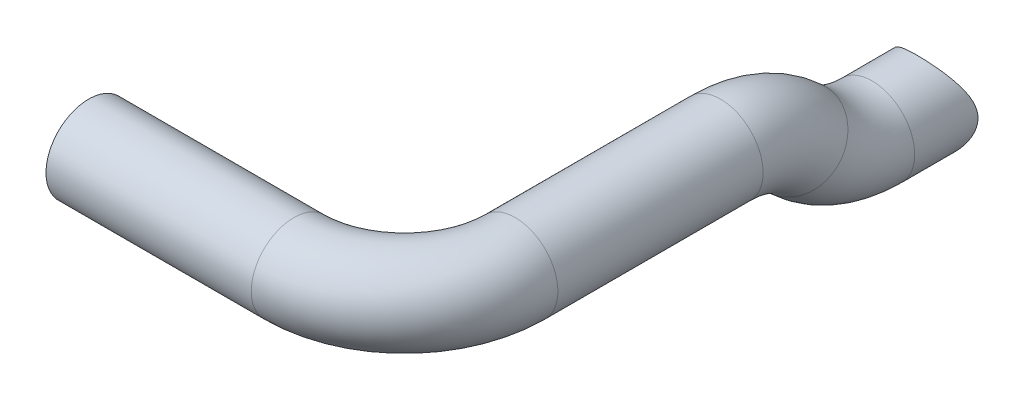
ISO-10303-21;
HEADER;
FILE_DESCRIPTION(('STEP AP214'),'2;1');
FILE_NAME('part.step','',(''),(''),'','','');
FILE_SCHEMA(('AUTOMOTIVE_DESIGN { 1 0 10303 214 1 1 1 1 }'));
ENDSEC;
DATA;
#1=APPLICATION_CONTEXT('core data for automotive mechanical design processes');
#2=APPLICATION_PROTOCOL_DEFINITION('international standard','automotive_design',2000,#1);
#3=PRODUCT_CONTEXT('',#1,'mechanical');
#4=PRODUCT('Part','Part','',(#3));
#5=PRODUCT_RELATED_PRODUCT_CATEGORY('part','',(#4));
#6=PRODUCT_DEFINITION_FORMATION('','',#4);
#7=PRODUCT_DEFINITION_CONTEXT('part definition',#1,'design');
#8=PRODUCT_DEFINITION('design','',#6,#7);
#9=PRODUCT_DEFINITION_SHAPE('','',#8);
#10=(LENGTH_UNIT() NAMED_UNIT(*) SI_UNIT(.MILLI.,.METRE.));
#11=(NAMED_UNIT(*) PLANE_ANGLE_UNIT() SI_UNIT($,.RADIAN.));
#12=(NAMED_UNIT(*) SI_UNIT($,.STERADIAN.) SOLID_ANGLE_UNIT());
#13=UNCERTAINTY_MEASURE_WITH_UNIT(LENGTH_MEASURE(1.E-05),#10,'distance_accuracy_value','');
#14=(GEOMETRIC_REPRESENTATION_CONTEXT(3) GLOBAL_UNCERTAINTY_ASSIGNED_CONTEXT((#13)) GLOBAL_UNIT_ASSIGNED_CONTEXT((#10,
#11,#12)) REPRESENTATION_CONTEXT('',''));
#15=CARTESIAN_POINT('',(0.,0.,0.));
#16=DIRECTION('',(0.,0.,1.));
#17=DIRECTION('',(1.,0.,0.));
#18=AXIS2_PLACEMENT_3D('',#15,#16,#17);
#19=CARTESIAN_POINT('',(120.3546666667,-3.253,-23.91274872028));
#20=DIRECTION('',(0.,1.,0.));
#21=DIRECTION('',(1.,0.,0.));
#22=AXIS2_PLACEMENT_3D('',#19,#20,#21);
#23=CYLINDRICAL_SURFACE('',#22,1.13);
#24=CARTESIAN_POINT('',(121.1846666667,-2.083,-23.1459371397728));
#25=CARTESIAN_POINT('',(121.184663195827,-2.08970584403159,-23.145933500202));
#26=CARTESIAN_POINT('',(121.184579157766,-2.09641156233646,-23.1458424237519));
#27=CARTESIAN_POINT('',(121.184250240362,-2.10982052598995,-23.1454865738916));
#28=CARTESIAN_POINT('',(121.184005215456,-2.11652376360211,-23.1452216432854));
#29=CARTESIAN_POINT('',(121.183353926349,-2.12992775395651,-23.1445185187287));
#30=CARTESIAN_POINT('',(121.182947316875,-2.1366284704212,-23.1440799537652));
#31=CARTESIAN_POINT('',(121.181972259009,-2.15002745692905,-23.1430306064148));
#32=CARTESIAN_POINT('',(121.181403268735,-2.15672564229841,-23.1424192474639));
#33=CARTESIAN_POINT('',(121.180102488248,-2.17011961686343,-23.1410255731264));
#34=CARTESIAN_POINT('',(121.179369963999,-2.17681525444029,-23.1402424872192));
#35=CARTESIAN_POINT('',(121.177740838018,-2.19020420403406,-23.1385069409094));
#36=CARTESIAN_POINT('',(121.176843316138,-2.19689728083481,-23.1375535315454));
#37=CARTESIAN_POINT('',(121.174882592161,-2.21028119514425,-23.1354792137625));
#38=CARTESIAN_POINT('',(121.173818291057,-2.21697169944257,-23.1343571964583));
#39=CARTESIAN_POINT('',(121.171522088226,-2.23035056902467,-23.1319478422526));
#40=CARTESIAN_POINT('',(121.170288916933,-2.23703849126574,-23.1306592576602));
#41=CARTESIAN_POINT('',(121.167652739483,-2.25041230820392,-23.1279192537649));
#42=CARTESIAN_POINT('',(121.166248302266,-2.25709764091098,-23.1264664710225));
#43=CARTESIAN_POINT('',(121.163267054886,-2.27046639869685,-23.123400870069));
#44=CARTESIAN_POINT('',(121.161688661795,-2.27714913650058,-23.1217865971046));
#45=CARTESIAN_POINT('',(121.158356657535,-2.29051283017872,-23.1184011263893));
#46=CARTESIAN_POINT('',(121.156601321372,-2.29719296987974,-23.1166284076623));
#47=CARTESIAN_POINT('',(121.152912331049,-2.3105515956157,-23.1129295141299));
#48=CARTESIAN_POINT('',(121.150976820198,-2.31722913553653,-23.1110017778609));
#49=CARTESIAN_POINT('',(121.146923974354,-2.33058269198966,-23.1069965421629));
#50=CARTESIAN_POINT('',(121.144804659272,-2.3372576338056,-23.1049174645138));
#51=CARTESIAN_POINT('',(121.140380921783,-2.35060611652245,-23.100614020992));
#52=CARTESIAN_POINT('',(121.138074411881,-2.3572784574301,-23.0983880902369));
#53=CARTESIAN_POINT('',(121.130817708815,-2.37743643107777,-23.0914479718132));
#54=CARTESIAN_POINT('',(121.125618236429,-2.39077327648081,-23.0865589627853));
#55=CARTESIAN_POINT('',(121.115117209597,-2.41585535793519,-23.0768891349065));
#56=CARTESIAN_POINT('',(121.109868249719,-2.42763478960385,-23.072139141784));
#57=CARTESIAN_POINT('',(121.098840226453,-2.45095095059159,-23.062360314023));
#58=CARTESIAN_POINT('',(121.093057408076,-2.46248512740306,-23.0573296210753));
#59=CARTESIAN_POINT('',(121.080938809302,-2.48530865822642,-23.0470162742386));
#60=CARTESIAN_POINT('',(121.07459823001,-2.49659457420495,-23.0417316569328));
#61=CARTESIAN_POINT('',(121.061344201302,-2.51892325054387,-23.030943347859));
#62=CARTESIAN_POINT('',(121.054424989769,-2.52996170714015,-23.0254378327392));
#63=CARTESIAN_POINT('',(121.039992474323,-2.55179607857784,-23.0142427176792));
#64=CARTESIAN_POINT('',(121.032472501547,-2.56258682629204,-23.0085516440755));
#65=CARTESIAN_POINT('',(121.016817585285,-2.58392681678535,-22.9970238422484));
#66=CARTESIAN_POINT('',(121.008675152511,-2.59447007163131,-22.9911862069857));
#67=CARTESIAN_POINT('',(120.991754141716,-2.6153153562977,-22.9794065871042));
#68=CARTESIAN_POINT('',(120.982967338478,-2.62561062221798,-22.9734644571146));
#69=CARTESIAN_POINT('',(120.964738936015,-2.64596261308059,-22.9615218105159));
#70=CARTESIAN_POINT('',(120.955288511592,-2.6560119112381,-22.955522116837));
#71=CARTESIAN_POINT('',(120.936106340222,-2.67546129002668,-22.9437534709826));
#72=CARTESIAN_POINT('',(120.926385527892,-2.6848708397495,-22.9379823548586));
#73=CARTESIAN_POINT('',(120.906568807214,-2.70314051839033,-22.9266285866594));
#74=CARTESIAN_POINT('',(120.896478240802,-2.71200557537187,-22.9210445556738));
#75=CARTESIAN_POINT('',(120.875923696028,-2.72918857758146,-22.9100895386212));
#76=CARTESIAN_POINT('',(120.865464270063,-2.73751098305981,-22.9047170149463));
#77=CARTESIAN_POINT('',(120.844172951565,-2.75360866440838,-22.8942089018435));
#78=CARTESIAN_POINT('',(120.833344803317,-2.76138785714397,-22.8890717344284));
#79=CARTESIAN_POINT('',(120.811318682395,-2.776399770504,-22.8790590609511));
#80=CARTESIAN_POINT('',(120.80012362487,-2.78363576126259,-22.8741820507031));
#81=CARTESIAN_POINT('',(120.777367584698,-2.79756211306074,-22.8647148277309));
#82=CARTESIAN_POINT('',(120.765808695889,-2.80425500581756,-22.8601233107571));
#83=CARTESIAN_POINT('',(120.742329845951,-2.81709518173034,-22.8512525058714));
#84=CARTESIAN_POINT('',(120.7304111919,-2.82324418065006,-22.846972244275));
#85=CARTESIAN_POINT('',(120.706220573162,-2.83500020380438,-22.8387502100589));
#86=CARTESIAN_POINT('',(120.69394918429,-2.84060805272077,-22.8348079234414));
#87=CARTESIAN_POINT('',(120.668560265219,-2.85148489508436,-22.8271365976457));
#88=CARTESIAN_POINT('',(120.655428534329,-2.85673129977214,-22.823422437633));
#89=CARTESIAN_POINT('',(120.628983746825,-2.86651466285795,-22.8164665664397));
#90=CARTESIAN_POINT('',(120.615675218096,-2.87105990395715,-22.8132193761851));
#91=CARTESIAN_POINT('',(120.595540205918,-2.87736479143018,-22.8086985534249));
#92=CARTESIAN_POINT('',(120.588828467009,-2.87937352441683,-22.8072552953357));
#93=CARTESIAN_POINT('',(120.575367033154,-2.88321556919285,-22.8044895821479));
#94=CARTESIAN_POINT('',(120.568617686032,-2.88504969335129,-22.8031665690586));
#95=CARTESIAN_POINT('',(120.555083500124,-2.88854256273068,-22.800642485731));
#96=CARTESIAN_POINT('',(120.548298943222,-2.89020203577365,-22.7994409103326));
#97=CARTESIAN_POINT('',(120.534696479003,-2.89334569982063,-22.7971606950509));
#98=CARTESIAN_POINT('',(120.527878794118,-2.89483052858156,-22.7960816084082));
#99=CARTESIAN_POINT('',(120.514212334659,-2.89762499306261,-22.7940473502006));
#100=CARTESIAN_POINT('',(120.507363728271,-2.89893517172633,-22.7930917949013));
#101=CARTESIAN_POINT('',(120.493637686677,-2.90138043314288,-22.7913055295263));
#102=CARTESIAN_POINT('',(120.486760371764,-2.90251595977964,-22.7904745030997));
#103=CARTESIAN_POINT('',(120.472979204342,-2.90461201729796,-22.7889381853188));
#104=CARTESIAN_POINT('',(120.466075431085,-2.90557288941229,-22.7882326488467));
#105=CARTESIAN_POINT('',(120.452243659019,-2.90731974200119,-22.7869481576406));
#106=CARTESIAN_POINT('',(120.445315705829,-2.90810595816432,-22.7863690323403));
#107=CARTESIAN_POINT('',(120.431437907806,-2.90950360430375,-22.7853381673605));
#108=CARTESIAN_POINT('',(120.424488082799,-2.91011516228747,-22.7848863343915));
#109=CARTESIAN_POINT('',(120.410568895564,-2.91116360408358,-22.7841108147665));
#110=CARTESIAN_POINT('',(120.403599535541,-2.91160050687403,-22.7837871141877));
#111=CARTESIAN_POINT('',(120.389643651381,-2.91229973398238,-22.7832685767372));
#112=CARTESIAN_POINT('',(120.382657120221,-2.91256196771364,-22.7830738067317));
#113=CARTESIAN_POINT('',(120.368669288545,-2.91291201760237,-22.7828138043035));
#114=CARTESIAN_POINT('',(120.361667980275,-2.91299963395863,-22.7827487202706));
#115=CARTESIAN_POINT('',(120.347669136344,-2.91300036584358,-22.7827487202894));
#116=CARTESIAN_POINT('',(120.340671600689,-2.91291357563969,-22.7828137340228));
#117=CARTESIAN_POINT('',(120.326690807491,-2.91256500660401,-22.7830734654796));
#118=CARTESIAN_POINT('',(120.319707542685,-2.91230341561367,-22.7832680439716));
#119=CARTESIAN_POINT('',(120.305757681092,-2.91160540534231,-22.7837860963929));
#120=CARTESIAN_POINT('',(120.298791078248,-2.91116906430142,-22.7841095126379));
#121=CARTESIAN_POINT('',(120.284876893328,-2.9101216502166,-22.7848843899591));
#122=CARTESIAN_POINT('',(120.277929314913,-2.90951054564773,-22.7853358741368));
#123=CARTESIAN_POINT('',(120.264055497046,-2.90811371806582,-22.7863659961899));
#124=CARTESIAN_POINT('',(120.25712927937,-2.90732785437025,-22.7869447365032));
#125=CARTESIAN_POINT('',(120.243300465387,-2.90558161658266,-22.788228440589));
#126=CARTESIAN_POINT('',(120.236397917141,-2.90462099407581,-22.7889335840189));
#127=CARTESIAN_POINT('',(120.222618687907,-2.90252534617488,-22.7904691266355));
#128=CARTESIAN_POINT('',(120.215742089093,-2.90138996685363,-22.7912997799476));
#129=CARTESIAN_POINT('',(120.202016969988,-2.89894491030684,-22.793085337926));
#130=CARTESIAN_POINT('',(120.195168573376,-2.89763477661248,-22.794040567843));
#131=CARTESIAN_POINT('',(120.181502026982,-2.89484031206345,-22.7960742418119));
#132=CARTESIAN_POINT('',(120.174684049213,-2.89335542586477,-22.7971530783681));
#133=CARTESIAN_POINT('',(120.161080496683,-2.89021155725573,-22.7994328875654));
#134=CARTESIAN_POINT('',(120.15429514859,-2.88855192494563,-22.8006343155864));
#135=CARTESIAN_POINT('',(120.140758883827,-2.88505864502703,-22.8031582252016));
#136=CARTESIAN_POINT('',(120.134008253644,-2.88322425776417,-22.8044812204116));
#137=CARTESIAN_POINT('',(120.120543760124,-2.87938160209645,-22.8072470468546));
#138=CARTESIAN_POINT('',(120.113830249545,-2.87737250990831,-22.8086904443554));
#139=CARTESIAN_POINT('',(120.093688504424,-2.87106615450794,-22.8132120997498));
#140=CARTESIAN_POINT('',(120.080375044206,-2.86651978736758,-22.8164601320418));
#141=CARTESIAN_POINT('',(120.05391840027,-2.85673412113154,-22.8234185950705));
#142=CARTESIAN_POINT('',(120.040779788619,-2.8514864623552,-22.8271345669073));
#143=CARTESIAN_POINT('',(120.01539017231,-2.84061189312476,-22.834806103652));
#144=CARTESIAN_POINT('',(120.003124606438,-2.83500814941277,-22.8387464077012));
#145=CARTESIAN_POINT('',(119.978943881549,-2.82325902951703,-22.8469646311154));
#146=CARTESIAN_POINT('',(119.967029352901,-2.81711274977971,-22.8512431124019));
#147=CARTESIAN_POINT('',(119.943556914149,-2.80427703486265,-22.8601107365458));
#148=CARTESIAN_POINT('',(119.932000370113,-2.79758580589364,-22.8647008963638));
#149=CARTESIAN_POINT('',(119.909247269747,-2.78366171598276,-22.874165950938));
#150=CARTESIAN_POINT('',(119.898052869872,-2.77642624704275,-22.8790421883581));
#151=CARTESIAN_POINT('',(119.876026372981,-2.7614143285606,-22.8890540290728));
#152=CARTESIAN_POINT('',(119.865197256141,-2.75363453587379,-22.8941911701613));
#153=CARTESIAN_POINT('',(119.843902373261,-2.73753461201064,-22.9047001055299));
#154=CARTESIAN_POINT('',(119.833440417741,-2.7292104952379,-22.9100735068608));
#155=CARTESIAN_POINT('',(119.812879311228,-2.71202296382144,-22.9210312718269));
#156=CARTESIAN_POINT('',(119.802784779366,-2.70315502466749,-22.926617197707));
#157=CARTESIAN_POINT('',(119.782958543689,-2.68487870042109,-22.9379759854712));
#158=CARTESIAN_POINT('',(119.773232245965,-2.675465330774,-22.9437502482223));
#159=CARTESIAN_POINT('',(119.75404913676,-2.65601759943559,-22.9555194696));
#160=CARTESIAN_POINT('',(119.744602774161,-2.64597418843514,-22.9615164973709));
#161=CARTESIAN_POINT('',(119.726381250997,-2.62563218588845,-22.9734542900367));
#162=CARTESIAN_POINT('',(119.717597331514,-2.61534097007222,-22.9793942446481));
#163=CARTESIAN_POINT('',(119.700680730583,-2.59450224465622,-22.991170228511));
#164=CARTESIAN_POINT('',(119.692539896834,-2.58396144058893,-22.9970064043008));
#165=CARTESIAN_POINT('',(119.676886932789,-2.56262475152376,-23.008532085821));
#166=CARTESIAN_POINT('',(119.669367388249,-2.55183479520589,-23.0142224906524));
#167=CARTESIAN_POINT('',(119.654934539095,-2.53000042114487,-23.0254171677441));
#168=CARTESIAN_POINT('',(119.648014642998,-2.51896111041519,-23.0309228962881));
#169=CARTESIAN_POINT('',(119.634758103177,-2.49662914857947,-23.0417126272034));
#170=CARTESIAN_POINT('',(119.628415776128,-2.48534074182107,-23.0469984266107));
#171=CARTESIAN_POINT('',(119.616292650616,-2.46251060711602,-23.0573151516019));
#172=CARTESIAN_POINT('',(119.61050713189,-2.45097226025554,-23.0623480067558));
#173=CARTESIAN_POINT('',(119.599472519993,-2.42764630020002,-23.0721324200413));
#174=CARTESIAN_POINT('',(119.594219750712,-2.41586118524235,-23.0768857948895));
#175=CARTESIAN_POINT('',(119.583715173845,-2.39077657817982,-23.0865588922083));
#176=CARTESIAN_POINT('',(119.578515552849,-2.3774431504112,-23.0914480417099));
#177=CARTESIAN_POINT('',(119.571258881967,-2.35728973078857,-23.0983881274322));
#178=CARTESIAN_POINT('',(119.56895238654,-2.35061867932468,-23.1006140451935));
#179=CARTESIAN_POINT('',(119.56452865869,-2.33727255258557,-23.1049174797221));
#180=CARTESIAN_POINT('',(119.562409342236,-2.33059867553898,-23.1069965589041));
#181=CARTESIAN_POINT('',(119.558356494365,-2.31724701072971,-23.1110017963496));
#182=CARTESIAN_POINT('',(119.556420986395,-2.31057029596471,-23.1129295301534));
#183=CARTESIAN_POINT('',(119.552731996888,-2.29721308677301,-23.1166284228187));
#184=CARTESIAN_POINT('',(119.55097666258,-2.29053353658549,-23.1184011399458));
#185=CARTESIAN_POINT('',(119.54764465817,-2.27717078722187,-23.1217866106975));
#186=CARTESIAN_POINT('',(119.546066267299,-2.27048840229484,-23.123400881646));
#187=CARTESIAN_POINT('',(119.543085019815,-2.25712011587822,-23.126466482617));
#188=CARTESIAN_POINT('',(119.541680584812,-2.25043489972661,-23.1279192632727));
#189=CARTESIAN_POINT('',(119.539044407038,-2.23706108144197,-23.1306592674174));
#190=CARTESIAN_POINT('',(119.537811238037,-2.23037303940713,-23.1319478497779));
#191=CARTESIAN_POINT('',(119.535515034731,-2.21699369574229,-23.1343572044091));
#192=CARTESIAN_POINT('',(119.534450735955,-2.21030283536277,-23.1354792193827));
#193=CARTESIAN_POINT('',(119.532490011326,-2.19691797427832,-23.1375535377954));
#194=CARTESIAN_POINT('',(119.531592491794,-2.19022430514495,-23.138506944755));
#195=CARTESIAN_POINT('',(119.529963364978,-2.17683393610434,-23.1402424919079));
#196=CARTESIAN_POINT('',(119.529230843066,-2.17013746997709,-23.1410255753768));
#197=CARTESIAN_POINT('',(119.527930061547,-2.15674160332449,-23.1424192507885));
#198=CARTESIAN_POINT('',(119.527361073566,-2.15004235322652,-23.1430306073123));
#199=CARTESIAN_POINT('',(119.526386014455,-2.1366410019755,-23.1440799559835));
#200=CARTESIAN_POINT('',(119.525979407194,-2.12993898458261,-23.1445185185796));
#201=CARTESIAN_POINT('',(119.525328116603,-2.11653215695284,-23.1452216447272));
#202=CARTESIAN_POINT('',(119.52508309378,-2.10982738237808,-23.1454865730828));
#203=CARTESIAN_POINT('',(119.524754174659,-2.09641510849707,-23.1458424248141));
#204=CARTESIAN_POINT('',(119.524670138542,-2.08970761662038,-23.145933499183));
#205=CARTESIAN_POINT('',(119.5246666667,-2.083,-23.1459371397728));
#206=B_SPLINE_CURVE_WITH_KNOTS('',3,(#24,#25,#26,#27,#28,#29,#30,#31,#32,#33,#34,#35,#36,#37,
#38,#39,#40,#41,#42,#43,#44,#45,#46,#47,#48,#49,#50,#51,#52,#53,#54,#55,#56,#57,#58,#59,#60,#61,
#62,#63,#64,#65,#66,#67,#68,#69,#70,#71,#72,#73,#74,#75,#76,#77,#78,#79,#80,#81,#82,#83,#84,#85,
#86,#87,#88,#89,#90,#91,#92,#93,#94,#95,#96,#97,#98,#99,#100,#101,#102,#103,#104,#105,#106,#107,
#108,#109,#110,#111,#112,#113,#114,#115,#116,#117,#118,#119,#120,#121,#122,#123,#124,#125,#126,
#127,#128,#129,#130,#131,#132,#133,#134,#135,#136,#137,#138,#139,#140,#141,#142,#143,#144,#145,
#146,#147,#148,#149,#150,#151,#152,#153,#154,#155,#156,#157,#158,#159,#160,#161,#162,#163,#164,
#165,#166,#167,#168,#169,#170,#171,#172,#173,#174,#175,#176,#177,#178,#179,#180,#181,#182,#183,
#184,#185,#186,#187,#188,#189,#190,#191,#192,#193,#194,#195,#196,#197,#198,#199,#200,#201,#202,
#203,#204,#205),.UNSPECIFIED.,.F.,.F.,(4,2,2,2,2,2,2,2,2,2,2,2,2,2,2,2,2,2,2,2,2,2,2,2,2,2,2,2,
2,2,2,2,2,2,2,2,2,2,2,2,2,2,2,2,2,2,2,2,2,2,2,2,2,2,2,2,2,2,2,2,2,2,2,2,2,2,2,2,2,2,2,2,2,2,2,2,
2,2,2,2,2,2,2,2,2,2,2,2,2,2,4),(0.,0.0201164341580257,0.0402510823644304,0.0604289874976523,
0.0806750318998189,0.101013847801801,0.12146973226172,0.142066567993333,0.162827751226442,
0.183776127475705,0.204933935813842,0.226322761966967,0.247963500287988,0.269876324429957,
0.292080666343086,0.337433354603585,0.378648220775549,0.420179011192732,0.462110698291808,
0.504525842749896,0.547504216634104,0.591122499206724,0.635454046522732,0.680568732541634,
0.724679832809767,0.768302743774303,0.811503978942484,0.854352015385038,0.896917034643547,
0.939270624985997,0.981485450110079,1.023634891177,1.06747362558855,1.11074654262951,
1.13220294517701,1.15355406875851,1.17481236452393,1.19599044735147,1.21710107591611,
1.23815713151249,1.25917159579072,1.28015752758468,1.30112803903185,1.32209627119827,
1.3430753694331,1.36407845868298,1.38507019873376,1.40603941719502,1.42699925766917,
1.4479628813979,1.46894344250313,1.4899540632949,1.51100780987685,1.53211766827373,
1.55329652129398,1.57455712632516,1.59591209424018,1.61737386957064,1.6606620800953,
1.70452208323808,1.74664969133256,1.78884883358528,1.83119297804938,1.87375484210897,
1.9166060349735,1.95981672763966,2.00345535710337,2.04758836979065,2.0926804091562,
2.13699571123124,2.18060421944289,2.22357933141676,2.26599773578155,2.30793917783098,
2.34948615202682,2.39072352274135,2.43606744620016,2.45826826975249,2.48017817591959,
2.50181661536888,2.52320377955341,2.54436057947276,2.56530861610441,2.5860701421356,
2.60666801482442,2.62712564005346,2.64746690790167,2.6677161203381,2.68789791192085,
2.70803716464934,2.72815891835082),.UNSPECIFIED.);
#207=CARTESIAN_POINT('',(121.1846666667,-2.083,-23.14593713977));
#208=VERTEX_POINT('',#207);
#209=CARTESIAN_POINT('',(119.5246666667,-2.083,-23.1459371397728));
#210=VERTEX_POINT('',#209);
#211=EDGE_CURVE('E175',#208,#210,#206,.T.);
#212=ORIENTED_EDGE('',*,*,#211,.T.);
#213=CARTESIAN_POINT('',(119.5246666667,-2.083,-23.1459371397728));
#214=CARTESIAN_POINT('',(119.524670137574,-2.07629415596943,-23.145933500202));
#215=CARTESIAN_POINT('',(119.524754175634,-2.06958843766559,-23.1458424237519));
#216=CARTESIAN_POINT('',(119.525083093038,-2.05617947401401,-23.1454865738916));
#217=CARTESIAN_POINT('',(119.525328117944,-2.04947623640274,-23.1452216432854));
#218=CARTESIAN_POINT('',(119.525979407051,-2.03607224604998,-23.1445185187287));
#219=CARTESIAN_POINT('',(119.526386016525,-2.02937152958604,-23.1440799537652));
#220=CARTESIAN_POINT('',(119.527361074391,-2.01597254307955,-23.1430306064148));
#221=CARTESIAN_POINT('',(119.527930064665,-2.00927435771081,-23.1424192474639));
#222=CARTESIAN_POINT('',(119.529230845152,-1.99588038314688,-23.1410255731264));
#223=CARTESIAN_POINT('',(119.529963369401,-1.9891847455705,-23.1402424872192));
#224=CARTESIAN_POINT('',(119.531592495382,-1.97579579597755,-23.1385069409094));
#225=CARTESIAN_POINT('',(119.532490017262,-1.96910271917714,-23.1375535315454));
#226=CARTESIAN_POINT('',(119.534450741239,-1.95571880486825,-23.1354792137625));
#227=CARTESIAN_POINT('',(119.535515042343,-1.94902830057013,-23.1343571964583));
#228=CARTESIAN_POINT('',(119.537811245174,-1.93564943098831,-23.1319478422525));
#229=CARTESIAN_POINT('',(119.539044416467,-1.9289615087473,-23.1306592576602));
#230=CARTESIAN_POINT('',(119.541680593917,-1.91558769180912,-23.1279192537649));
#231=CARTESIAN_POINT('',(119.543085031134,-1.908902359102,-23.1264664710225));
#232=CARTESIAN_POINT('',(119.546066278514,-1.89553360131586,-23.123400870069));
#233=CARTESIAN_POINT('',(119.547644671605,-1.88885086351193,-23.1217865971046));
#234=CARTESIAN_POINT('',(119.550976675865,-1.87548716983324,-23.1184011263893));
#235=CARTESIAN_POINT('',(119.552732012028,-1.86880703013188,-23.1166284076623));
#236=CARTESIAN_POINT('',(119.556421002351,-1.8554484043951,-23.1129295141299));
#237=CARTESIAN_POINT('',(119.558356513202,-1.84877086447379,-23.1110017778608));
#238=CARTESIAN_POINT('',(119.562409359046,-1.83541730801957,-23.1069965421629));
#239=CARTESIAN_POINT('',(119.564528674128,-1.82874236620302,-23.1049174645138));
#240=CARTESIAN_POINT('',(119.568952411617,-1.81539388348481,-23.1006140209919));
#241=CARTESIAN_POINT('',(119.571258921519,-1.80872154257641,-23.0983880902368));
#242=CARTESIAN_POINT('',(119.578515624585,-1.7885635689261,-23.0914479718131));
#243=CARTESIAN_POINT('',(119.583715096971,-1.77522672352103,-23.0865589627854));
#244=CARTESIAN_POINT('',(119.594216123799,-1.75014464207445,-23.0768891349107));
#245=CARTESIAN_POINT('',(119.599465083672,-1.73836521041526,-23.0721391417926));
#246=CARTESIAN_POINT('',(119.610493106929,-1.7150490494438,-23.0623603140387));
#247=CARTESIAN_POINT('',(119.616275925302,-1.70351487263921,-23.0573296210939));
#248=CARTESIAN_POINT('',(119.62839452407,-1.68069134182678,-23.0470162742615));
#249=CARTESIAN_POINT('',(119.634735103361,-1.66940542585237,-23.0417316569572));
#250=CARTESIAN_POINT('',(119.647989132066,-1.64707674951891,-23.0309433478853));
#251=CARTESIAN_POINT('',(119.654908343597,-1.63603829292404,-23.0254378327657));
#252=CARTESIAN_POINT('',(119.669340859043,-1.61420392148636,-23.0142427177052));
#253=CARTESIAN_POINT('',(119.67686083182,-1.60341317377085,-23.0085516441006));
#254=CARTESIAN_POINT('',(119.692515748084,-1.58207318327208,-22.9970238422708));
#255=CARTESIAN_POINT('',(119.70065818086,-1.57152992842206,-22.9911862070062));
#256=CARTESIAN_POINT('',(119.71757919166,-1.55068464374482,-22.97940658712));
#257=CARTESIAN_POINT('',(119.726365994903,-1.54038937781784,-22.9734644571276));
#258=CARTESIAN_POINT('',(119.744594397374,-1.52003738693871,-22.9615218105227));
#259=CARTESIAN_POINT('',(119.754044821803,-1.50998808877145,-22.9555221168403));
#260=CARTESIAN_POINT('',(119.773226993173,-1.4905387099752,-22.9437534709861));
#261=CARTESIAN_POINT('',(119.782947805496,-1.48112916025398,-22.9379823548655));
#262=CARTESIAN_POINT('',(119.802764526164,-1.46285948161609,-22.9266285866716));
#263=CARTESIAN_POINT('',(119.812855092572,-1.45399442463592,-22.9210445556881));
#264=CARTESIAN_POINT('',(119.833409637339,-1.43681142242846,-22.9100895386383));
#265=CARTESIAN_POINT('',(119.843869063302,-1.42848901695089,-22.9047170149644));
#266=CARTESIAN_POINT('',(119.865160381795,-1.41239133560334,-22.8942089018624));
#267=CARTESIAN_POINT('',(119.875988530042,-1.40461214286803,-22.8890717344474));
#268=CARTESIAN_POINT('',(119.898014650964,-1.38960022950801,-22.8790590609692));
#269=CARTESIAN_POINT('',(119.90920970849,-1.38236423874918,-22.8741820507203));
#270=CARTESIAN_POINT('',(119.931965748665,-1.36843788694998,-22.8647148277458));
#271=CARTESIAN_POINT('',(119.943524637476,-1.36174499419242,-22.8601233107706));
#272=CARTESIAN_POINT('',(119.967003487421,-1.34890481827755,-22.8512525058815));
#273=CARTESIAN_POINT('',(119.978922141477,-1.34275581935656,-22.8469722442832));
#274=CARTESIAN_POINT('',(120.003112760225,-1.33099979619911,-22.838750210063));
#275=CARTESIAN_POINT('',(120.015384149103,-1.32539194728093,-22.8348079234433));
#276=CARTESIAN_POINT('',(120.040773068183,-1.3145151049158,-22.8271365976451));
#277=CARTESIAN_POINT('',(120.053904799075,-1.30926870022807,-22.8234224376318));
#278=CARTESIAN_POINT('',(120.080349586583,-1.29948533714236,-22.8164665664377));
#279=CARTESIAN_POINT('',(120.093658115313,-1.29494009604319,-22.8132193761829));
#280=CARTESIAN_POINT('',(120.113793127494,-1.28863520857016,-22.8086985534224));
#281=CARTESIAN_POINT('',(120.120504866403,-1.28662647558352,-22.8072552953332));
#282=CARTESIAN_POINT('',(120.133966300259,-1.28278443080753,-22.8044895821454));
#283=CARTESIAN_POINT('',(120.140715647381,-1.28095030664909,-22.803166569056));
#284=CARTESIAN_POINT('',(120.15424983329,-1.27745743726972,-22.8006424857285));
#285=CARTESIAN_POINT('',(120.161034390192,-1.27579796422675,-22.7994409103301));
#286=CARTESIAN_POINT('',(120.174636854412,-1.27265430017977,-22.7971606950486));
#287=CARTESIAN_POINT('',(120.181454539296,-1.27116947141885,-22.796081608406));
#288=CARTESIAN_POINT('',(120.195120998756,-1.2683750069378,-22.7940473501986));
#289=CARTESIAN_POINT('',(120.201969605143,-1.26706482827408,-22.7930917948993));
#290=CARTESIAN_POINT('',(120.215695646737,-1.26461956685751,-22.7913055295246));
#291=CARTESIAN_POINT('',(120.22257296165,-1.26348404022075,-22.790474503098));
#292=CARTESIAN_POINT('',(120.236354129072,-1.26138798270241,-22.7889381853174));
#293=CARTESIAN_POINT('',(120.243257902328,-1.26042711058807,-22.7882326488454));
#294=CARTESIAN_POINT('',(120.257089674393,-1.25868025799915,-22.7869481576395));
#295=CARTESIAN_POINT('',(120.264017627582,-1.257894041836,-22.7863690323394));
#296=CARTESIAN_POINT('',(120.277895425604,-1.25649639569654,-22.7853381673598));
#297=CARTESIAN_POINT('',(120.28484525061,-1.25588483771279,-22.7848863343909));
#298=CARTESIAN_POINT('',(120.298764437844,-1.25483639591665,-22.7841108147661));
#299=CARTESIAN_POINT('',(120.305733797866,-1.25439949312617,-22.7837871141874));
#300=CARTESIAN_POINT('',(120.319689682024,-1.25370026601777,-22.7832685767371));
#301=CARTESIAN_POINT('',(120.326676213183,-1.25343803228648,-22.7830738067316));
#302=CARTESIAN_POINT('',(120.340664044857,-1.2530879823977,-22.7828138043035));
#303=CARTESIAN_POINT('',(120.347665353126,-1.2530003660414,-22.7827487202706));
#304=CARTESIAN_POINT('',(120.361664197055,-1.25299963415639,-22.7827487202894));
#305=CARTESIAN_POINT('',(120.368661732709,-1.25308642436025,-22.7828137340228));
#306=CARTESIAN_POINT('',(120.382642525905,-1.25343499339587,-22.7830734654795));
#307=CARTESIAN_POINT('',(120.38962579071,-1.25369658438619,-22.7832680439714));
#308=CARTESIAN_POINT('',(120.403575652301,-1.2543945946575,-22.7837860963926));
#309=CARTESIAN_POINT('',(120.410542255145,-1.25483093569836,-22.7841095126376));
#310=CARTESIAN_POINT('',(120.424456440063,-1.25587834978314,-22.7848843899586));
#311=CARTESIAN_POINT('',(120.431404018478,-1.256489454352,-22.7853358741362));
#312=CARTESIAN_POINT('',(120.445277836344,-1.25788628193387,-22.786365996189));
#313=CARTESIAN_POINT('',(120.452204054019,-1.25867214562943,-22.7869447365023));
#314=CARTESIAN_POINT('',(120.466032868001,-1.26041838341699,-22.7882284405879));
#315=CARTESIAN_POINT('',(120.472935416247,-1.26137900592383,-22.7889335840177));
#316=CARTESIAN_POINT('',(120.486714645481,-1.26347465382475,-22.790469126634));
#317=CARTESIAN_POINT('',(120.493591244294,-1.26461003314599,-22.791299779946));
#318=CARTESIAN_POINT('',(120.507316363399,-1.26705508969278,-22.7930853379242));
#319=CARTESIAN_POINT('',(120.514164760011,-1.26836522338714,-22.7940405678411));
#320=CARTESIAN_POINT('',(120.527831306405,-1.27115968793617,-22.7960742418099));
#321=CARTESIAN_POINT('',(120.534649284174,-1.27264457413485,-22.797153078366));
#322=CARTESIAN_POINT('',(120.548252836704,-1.27578844274389,-22.7994328875632));
#323=CARTESIAN_POINT('',(120.555038184798,-1.277448075054,-22.8006343155841));
#324=CARTESIAN_POINT('',(120.568574449562,-1.28094135497262,-22.8031582251993));
#325=CARTESIAN_POINT('',(120.575325079745,-1.28277574223549,-22.8044812204093));
#326=CARTESIAN_POINT('',(120.588789573266,-1.28661839790323,-22.8072470468523));
#327=CARTESIAN_POINT('',(120.595503083845,-1.2886274900914,-22.8086904443532));
#328=CARTESIAN_POINT('',(120.615644828968,-1.29493384549188,-22.8132120997478));
#329=CARTESIAN_POINT('',(120.628958289187,-1.29948021263232,-22.81646013204));
#330=CARTESIAN_POINT('',(120.655414933126,-1.30926587886837,-22.8234185950694));
#331=CARTESIAN_POINT('',(120.668553544779,-1.31451353764467,-22.8271345669067));
#332=CARTESIAN_POINT('',(120.693943161085,-1.32538810687251,-22.8348061036505));
#333=CARTESIAN_POINT('',(120.706208726953,-1.33099185058162,-22.838746407698));
#334=CARTESIAN_POINT('',(120.730389451834,-1.3427409704725,-22.8469646311091));
#335=CARTESIAN_POINT('',(120.742303980478,-1.34888725020788,-22.8512431123942));
#336=CARTESIAN_POINT('',(120.765776419224,-1.36172296512177,-22.8601107365354));
#337=CARTESIAN_POINT('',(120.777332963259,-1.36841419408961,-22.8647008963524));
#338=CARTESIAN_POINT('',(120.800086063622,-1.38233828399889,-22.8741659509247));
#339=CARTESIAN_POINT('',(120.811280463496,-1.38957375293853,-22.8790421883442));
#340=CARTESIAN_POINT('',(120.833306960388,-1.40458567142068,-22.8890540290582));
#341=CARTESIAN_POINT('',(120.844136077228,-1.41236546410792,-22.8941911701468));
#342=CARTESIAN_POINT('',(120.865430960112,-1.42846538797266,-22.904700105516));
#343=CARTESIAN_POINT('',(120.875892915633,-1.43678950474661,-22.9100735068476));
#344=CARTESIAN_POINT('',(120.896454022152,-1.45397703616628,-22.921031271816));
#345=CARTESIAN_POINT('',(120.906548554017,-1.46284497532228,-22.9266171976976));
#346=CARTESIAN_POINT('',(120.926374789702,-1.48112129957338,-22.9379759854659));
#347=CARTESIAN_POINT('',(120.936101087431,-1.49053466922316,-22.9437502482196));
#348=CARTESIAN_POINT('',(120.955284196638,-1.50998240056062,-22.9555194695987));
#349=CARTESIAN_POINT('',(120.964730559235,-1.52002581155713,-22.9615164973682));
#350=CARTESIAN_POINT('',(120.982952082395,-1.54036781409718,-22.9734542900316));
#351=CARTESIAN_POINT('',(120.991736001877,-1.55065902991072,-22.9793942446419));
#352=CARTESIAN_POINT('',(121.008652602806,-1.57149775532238,-22.991170228503));
#353=CARTESIAN_POINT('',(121.016793436554,-1.58203855938804,-22.997006404292));
#354=CARTESIAN_POINT('',(121.032446400598,-1.60337524845102,-23.0085320858112));
#355=CARTESIAN_POINT('',(121.039965945138,-1.61416520476837,-23.0142224906422));
#356=CARTESIAN_POINT('',(121.054398794292,-1.63599957882939,-23.0254171677337));
#357=CARTESIAN_POINT('',(121.061318690389,-1.64703888955964,-23.0309228962778));
#358=CARTESIAN_POINT('',(121.074575230212,-1.66937085139755,-23.0417126271939));
#359=CARTESIAN_POINT('',(121.080917557261,-1.6806592581576,-23.0469984266017));
#360=CARTESIAN_POINT('',(121.093040682775,-1.70348939286703,-23.0573151515946));
#361=CARTESIAN_POINT('',(121.098826201503,-1.71502773973027,-23.0623480067496));
#362=CARTESIAN_POINT('',(121.109860813404,-1.73835369979232,-23.0721324200379));
#363=CARTESIAN_POINT('',(121.115113582686,-1.75013881475379,-23.0768857948879));
#364=CARTESIAN_POINT('',(121.125618159555,-1.77522342181943,-23.0865588922082));
#365=CARTESIAN_POINT('',(121.130817780551,-1.7885568495872,-23.0914480417098));
#366=CARTESIAN_POINT('',(121.138074451433,-1.80871026920872,-23.098388127432));
#367=CARTESIAN_POINT('',(121.140380946859,-1.81538132067231,-23.1006140451933));
#368=CARTESIAN_POINT('',(121.14480467471,-1.82872744741085,-23.1049174797219));
#369=CARTESIAN_POINT('',(121.146923991164,-1.83540132445718,-23.1069965589038));
#370=CARTESIAN_POINT('',(121.150976839034,-1.848752989266,-23.1110017963493));
#371=CARTESIAN_POINT('',(121.152912347005,-1.8554297040308,-23.112929530153));
#372=CARTESIAN_POINT('',(121.156601336511,-1.86878691322215,-23.1166284228183));
#373=CARTESIAN_POINT('',(121.15835667082,-1.87546646340953,-23.1184011399454));
#374=CARTESIAN_POINT('',(121.16168867523,-1.88882921277292,-23.1217866106971));
#375=CARTESIAN_POINT('',(121.1632670661,-1.89551159769987,-23.1234008816456));
#376=CARTESIAN_POINT('',(121.166248313584,-1.90887988411638,-23.1264664826166));
#377=CARTESIAN_POINT('',(121.167652748588,-1.91556510026796,-23.1279192632723));
#378=CARTESIAN_POINT('',(121.170288926362,-1.9289389185526,-23.130659267417));
#379=CARTESIAN_POINT('',(121.171522095363,-1.93562696058747,-23.1319478497775));
#380=CARTESIAN_POINT('',(121.173818298669,-1.94900630425242,-23.1343572044087));
#381=CARTESIAN_POINT('',(121.174882597444,-1.95569716463203,-23.1354792193823));
#382=CARTESIAN_POINT('',(121.176843322074,-1.9690820257167,-23.137553537795));
#383=CARTESIAN_POINT('',(121.177740841606,-1.97577569485022,-23.1385069447547));
#384=CARTESIAN_POINT('',(121.179369968422,-1.98916606389116,-23.1402424919076));
#385=CARTESIAN_POINT('',(121.180102490334,-1.99586253001861,-23.1410255753764));
#386=CARTESIAN_POINT('',(121.181403271853,-2.00925839667167,-23.1424192507882));
#387=CARTESIAN_POINT('',(121.181972259834,-2.01595764676989,-23.1430306073121));
#388=CARTESIAN_POINT('',(121.182947318944,-2.02935899802149,-23.1440799559833));
#389=CARTESIAN_POINT('',(121.183353926206,-2.03606101541469,-23.1445185185794));
#390=CARTESIAN_POINT('',(121.184005216796,-2.04946784304514,-23.1452216447271));
#391=CARTESIAN_POINT('',(121.184250239619,-2.05617261762027,-23.1454865730827));
#392=CARTESIAN_POINT('',(121.184579158741,-2.06958489150207,-23.145842424814));
#393=CARTESIAN_POINT('',(121.184663194858,-2.07629238337919,-23.145933499183));
#394=CARTESIAN_POINT('',(121.1846666667,-2.083,-23.1459371397728));
#395=B_SPLINE_CURVE_WITH_KNOTS('',3,(#213,#214,#215,#216,#217,#218,#219,#220,#221,#222,#223,
#224,#225,#226,#227,#228,#229,#230,#231,#232,#233,#234,#235,#236,#237,#238,#239,#240,#241,#242,
#243,#244,#245,#246,#247,#248,#249,#250,#251,#252,#253,#254,#255,#256,#257,#258,#259,#260,#261,
#262,#263,#264,#265,#266,#267,#268,#269,#270,#271,#272,#273,#274,#275,#276,#277,#278,#279,#280,
#281,#282,#283,#284,#285,#286,#287,#288,#289,#290,#291,#292,#293,#294,#295,#296,#297,#298,#299,
#300,#301,#302,#303,#304,#305,#306,#307,#308,#309,#310,#311,#312,#313,#314,#315,#316,#317,#318,
#319,#320,#321,#322,#323,#324,#325,#326,#327,#328,#329,#330,#331,#332,#333,#334,#335,#336,#337,
#338,#339,#340,#341,#342,#343,#344,#345,#346,#347,#348,#349,#350,#351,#352,#353,#354,#355,#356,
#357,#358,#359,#360,#361,#362,#363,#364,#365,#366,#367,#368,#369,#370,#371,#372,#373,#374,#375,
#376,#377,#378,#379,#380,#381,#382,#383,#384,#385,#386,#387,#388,#389,#390,#391,#392,#393,#394),
.UNSPECIFIED.,.F.,.F.,(4,2,2,2,2,2,2,2,2,2,2,2,2,2,2,2,2,2,2,2,2,2,2,2,2,2,2,2,2,2,2,2,2,2,2,2,
2,2,2,2,2,2,2,2,2,2,2,2,2,2,2,2,2,2,2,2,2,2,2,2,2,2,2,2,2,2,2,2,2,2,2,2,2,2,2,2,2,2,2,2,2,2,2,2,
2,2,2,2,2,2,4),(0.,0.0201164341549533,0.0402510823586975,0.0604289874896754,0.0806750318900114,
0.101013847790576,0.121469732249492,0.142066567980506,0.162827751213417,0.183776127462877,
0.204933935801596,0.226322761955682,0.247963500278032,0.269876324421691,0.292080666336851,
0.337433354602415,0.378648220739945,0.420179011132495,0.462110698216801,0.504525842669975,
0.547504216559065,0.59112249914625,0.635454046486351,0.680568732538668,0.724679832788011,
0.768302743738919,0.811503978898786,0.854352015338522,0.896917034599879,0.939270624950942,
0.981485450089516,1.02363489117685,1.06747362559435,1.11074654263964,1.13220294518867,
1.15355406877127,1.17481236453735,1.19599044736514,1.21710107592956,1.23815713152525,
1.25917159580235,1.2801575275947,1.30112803903981,1.32209627120371,1.34307536943555,
1.36407845868199,1.38507019872968,1.40603941718824,1.42699925766011,1.44796288138698,
1.46894344249077,1.48995406328153,1.51100780986286,1.53211766825953,1.55329652127999,
1.57455712631177,1.5959120942278,1.61737386955966,1.66066208008829,1.70452208323653,
1.74664969131362,1.78884883355389,1.8311929780105,1.8737548420676,1.91660603493462,
1.95981672760821,2.00345535708425,2.04758836978866,2.09268040914094,2.13699571120641,
2.18060421941227,2.2235793313842,2.26599773575095,2.30793917780625,2.3494861520119,
2.39072352274015,2.43606744619673,2.45826826974817,2.48017817591453,2.50181661536324,
2.52320377954736,2.54436057946646,2.56530861609801,2.58607014212929,2.60666801481836,
2.62712564004783,2.64746690789664,2.66771612033385,2.68789791191754,2.70803716464715,
2.7281589183499),.UNSPECIFIED.);
#396=EDGE_CURVE('E133',#210,#208,#395,.T.);
#397=ORIENTED_EDGE('',*,*,#396,.T.);
#398=EDGE_LOOP('',(#212,#397));
#399=FACE_BOUND('',#398,.T.);
#400=ADVANCED_FACE('F17',(#399),#23,.F.);
#401=CARTESIAN_POINT('',(114.1966666667,-0.913,-12.8));
#402=DIRECTION('',(-1.,0.,0.));
#403=DIRECTION('',(0.,0.,1.));
#404=AXIS2_PLACEMENT_3D('',#401,#402,#403);
#405=PLANE('',#404);
#406=CARTESIAN_POINT('',(114.1966666667,-0.913,-12.8));
#407=DIRECTION('',(-1.,0.,0.));
#408=DIRECTION('',(0.,0.,1.));
#409=AXIS2_PLACEMENT_3D('',#406,#407,#408);
#410=CIRCLE('',#409,0.83);
#411=CARTESIAN_POINT('',(114.1966666667,-0.913,-11.97));
#412=VERTEX_POINT('',#411);
#413=EDGE_CURVE('E11',#412,#412,#410,.T.);
#414=ORIENTED_EDGE('',*,*,#413,.T.);
#415=EDGE_LOOP('',(#414));
#416=FACE_BOUND('',#415,.T.);
#417=ADVANCED_FACE('F161',(#416),#405,.T.);
#418=CARTESIAN_POINT('',(116.1966666667,-0.913,-12.8));
#419=DIRECTION('',(1.,0.,0.));
#420=DIRECTION('',(0.,0.,-1.));
#421=AXIS2_PLACEMENT_3D('',#418,#419,#420);
#422=CYLINDRICAL_SURFACE('',#421,0.83);
#423=CARTESIAN_POINT('',(118.1966666667,-0.913,-12.8));
#424=DIRECTION('',(1.,0.,0.));
#425=DIRECTION('',(0.,0.,1.));
#426=AXIS2_PLACEMENT_3D('',#423,#424,#425);
#427=CIRCLE('',#426,0.83);
#428=CARTESIAN_POINT('',(118.1966666667,-0.913,-13.63));
#429=VERTEX_POINT('',#428);
#430=CARTESIAN_POINT('',(118.1966666667,-0.913,-11.97));
#431=VERTEX_POINT('',#430);
#432=EDGE_CURVE('E122',#429,#431,#427,.T.);
#433=ORIENTED_EDGE('',*,*,#432,.F.);
#434=CARTESIAN_POINT('',(118.1966666667,-0.913,-12.8));
#435=DIRECTION('',(1.,0.,0.));
#436=DIRECTION('',(0.,0.,1.));
#437=AXIS2_PLACEMENT_3D('',#434,#435,#436);
#438=CIRCLE('',#437,0.83);
#439=EDGE_CURVE('E126',#431,#429,#438,.T.);
#440=ORIENTED_EDGE('',*,*,#439,.F.);
#441=DIRECTION('',(-1.,0.,0.));
#442=VECTOR('',#441,1.);
#443=CARTESIAN_POINT('',(116.1966666667,-0.913,-11.97));
#444=LINE('',#443,#442);
#445=EDGE_CURVE('E30',#431,#412,#444,.T.);
#446=ORIENTED_EDGE('',*,*,#445,.T.);
#447=ORIENTED_EDGE('',*,*,#413,.F.);
#448=ORIENTED_EDGE('',*,*,#445,.F.);
#449=EDGE_LOOP('',(#433,#440,#446,#447,#448));
#450=FACE_BOUND('',#449,.T.);
#451=ADVANCED_FACE('F262',(#450),#422,.T.);
#452=CARTESIAN_POINT('',(118.1966666667,-0.913,-14.958));
#453=DIRECTION('',(0.,-1.,0.));
#454=DIRECTION('',(0.,0.,-1.));
#455=AXIS2_PLACEMENT_3D('',#452,#453,#454);
#456=TOROIDAL_SURFACE('',#455,2.158,0.83);
#457=ORIENTED_EDGE('',*,*,#432,.T.);
#458=ORIENTED_EDGE('',*,*,#439,.T.);
#459=CARTESIAN_POINT('',(118.1966666667,-0.913,-14.958));
#460=DIRECTION('',(0.,1.,0.));
#461=DIRECTION('',(0.,0.,-1.));
#462=AXIS2_PLACEMENT_3D('',#459,#460,#461);
#463=CIRCLE('',#462,1.328);
#464=CARTESIAN_POINT('',(119.5246666667,-0.913,-14.958));
#465=VERTEX_POINT('',#464);
#466=EDGE_CURVE('E58',#429,#465,#463,.T.);
#467=ORIENTED_EDGE('',*,*,#466,.T.);
#468=CARTESIAN_POINT('',(120.3546666667,-0.913,-14.958));
#469=DIRECTION('',(0.,0.,1.));
#470=DIRECTION('',(0.,-1.,0.));
#471=AXIS2_PLACEMENT_3D('',#468,#469,#470);
#472=CIRCLE('',#471,0.83);
#473=EDGE_CURVE('E123',#465,#465,#472,.T.);
#474=ORIENTED_EDGE('',*,*,#473,.T.);
#475=ORIENTED_EDGE('',*,*,#466,.F.);
#476=EDGE_LOOP('',(#457,#458,#467,#474,#475));
#477=FACE_BOUND('',#476,.T.);
#478=ADVANCED_FACE('F257',(#477),#456,.T.);
#479=CARTESIAN_POINT('',(120.3546666667,-0.913,-16.958));
#480=DIRECTION('',(0.,0.,1.));
#481=DIRECTION('',(1.,0.,0.));
#482=AXIS2_PLACEMENT_3D('',#479,#480,#481);
#483=CYLINDRICAL_SURFACE('',#482,0.83);
#484=ORIENTED_EDGE('',*,*,#473,.F.);
#485=DIRECTION('',(0.,0.,-1.));
#486=VECTOR('',#485,1.);
#487=CARTESIAN_POINT('',(119.5246666667,-0.913,-16.958));
#488=LINE('',#487,#486);
#489=CARTESIAN_POINT('',(119.5246666667,-0.913,-18.958));
#490=VERTEX_POINT('',#489);
#491=EDGE_CURVE('E119',#465,#490,#488,.T.);
#492=ORIENTED_EDGE('',*,*,#491,.T.);
#493=CARTESIAN_POINT('',(120.3546666667,-0.913,-18.958));
#494=DIRECTION('',(0.,0.,-1.));
#495=DIRECTION('',(0.,-1.,0.));
#496=AXIS2_PLACEMENT_3D('',#493,#494,#495);
#497=CIRCLE('',#496,0.83);
#498=CARTESIAN_POINT('',(120.3546666667,-1.743,-18.958));
#499=VERTEX_POINT('',#498);
#500=EDGE_CURVE('E134',#499,#490,#497,.T.);
#501=ORIENTED_EDGE('',*,*,#500,.F.);
#502=CARTESIAN_POINT('',(120.3546666667,-0.913,-18.958));
#503=DIRECTION('',(0.,0.,-1.));
#504=DIRECTION('',(0.,-1.,0.));
#505=AXIS2_PLACEMENT_3D('',#502,#503,#504);
#506=CIRCLE('',#505,0.83);
#507=EDGE_CURVE('E128',#490,#499,#506,.T.);
#508=ORIENTED_EDGE('',*,*,#507,.F.);
#509=ORIENTED_EDGE('',*,*,#491,.F.);
#510=EDGE_LOOP('',(#484,#492,#501,#508,#509));
#511=FACE_BOUND('',#510,.T.);
#512=ADVANCED_FACE('F19',(#511),#483,.T.);
#513=CARTESIAN_POINT('',(120.3546666667,-3.071,-18.958));
#514=DIRECTION('',(-1.,0.,0.));
#515=DIRECTION('',(0.,0.,1.));
#516=AXIS2_PLACEMENT_3D('',#513,#514,#515);
#517=TOROIDAL_SURFACE('',#516,2.158,0.83);
#518=CARTESIAN_POINT('',(120.3546666667,-1.498,-20.43537436014));
#519=DIRECTION('',(0.,-0.684603503308785,-0.728915662650583));
#520=DIRECTION('',(0.,0.728915662650583,-0.684603503308785));
#521=AXIS2_PLACEMENT_3D('',#518,#519,#520);
#522=CIRCLE('',#521,0.83);
#523=CARTESIAN_POINT('',(120.3546666667,-0.893000000000018,-21.0035952678863));
#524=VERTEX_POINT('',#523);
#525=CARTESIAN_POINT('',(120.3546666667,-2.103,-19.8671534523937));
#526=VERTEX_POINT('',#525);
#527=EDGE_CURVE('E130',#524,#526,#522,.T.);
#528=ORIENTED_EDGE('',*,*,#527,.F.);
#529=CARTESIAN_POINT('',(120.3546666667,-1.498,-20.43537436014));
#530=DIRECTION('',(0.,-0.684603503308785,-0.728915662650583));
#531=DIRECTION('',(0.,0.728915662650583,-0.684603503308785));
#532=AXIS2_PLACEMENT_3D('',#529,#530,#531);
#533=CIRCLE('',#532,0.83);
#534=EDGE_CURVE('E98',#526,#524,#533,.T.);
#535=ORIENTED_EDGE('',*,*,#534,.F.);
#536=CARTESIAN_POINT('',(120.3546666667,-3.071,-18.958));
#537=DIRECTION('',(1.,0.,0.));
#538=DIRECTION('',(0.,0.,1.));
#539=AXIS2_PLACEMENT_3D('',#536,#537,#538);
#540=CIRCLE('',#539,1.328);
#541=EDGE_CURVE('E101',#526,#499,#540,.T.);
#542=ORIENTED_EDGE('',*,*,#541,.T.);
#543=ORIENTED_EDGE('',*,*,#500,.T.);
#544=ORIENTED_EDGE('',*,*,#507,.T.);
#545=ORIENTED_EDGE('',*,*,#541,.F.);
#546=EDGE_LOOP('',(#528,#535,#542,#543,#544,#545));
#547=FACE_BOUND('',#546,.T.);
#548=ADVANCED_FACE('F267',(#547),#517,.T.);
#549=CARTESIAN_POINT('',(120.3546666667,0.075,-21.91274872028));
#550=DIRECTION('',(-1.,0.,0.));
#551=DIRECTION('',(0.,0.,-1.));
#552=AXIS2_PLACEMENT_3D('',#549,#550,#551);
#553=TOROIDAL_SURFACE('',#552,2.158,0.83);
#554=ORIENTED_EDGE('',*,*,#527,.T.);
#555=ORIENTED_EDGE('',*,*,#534,.T.);
#556=CARTESIAN_POINT('',(120.3546666667,0.075,-21.91274872028));
#557=DIRECTION('',(1.,0.,0.));
#558=DIRECTION('',(0.,0.,-1.));
#559=AXIS2_PLACEMENT_3D('',#556,#557,#558);
#560=CIRCLE('',#559,1.328);
#561=CARTESIAN_POINT('',(120.3546666667,-1.253,-21.91274872028));
#562=VERTEX_POINT('',#561);
#563=EDGE_CURVE('E91',#524,#562,#560,.T.);
#564=ORIENTED_EDGE('',*,*,#563,.T.);
#565=CARTESIAN_POINT('',(120.3546666667,-2.083,-21.91274872028));
#566=DIRECTION('',(0.,0.,1.));
#567=DIRECTION('',(0.,1.,0.));
#568=AXIS2_PLACEMENT_3D('',#565,#566,#567);
#569=CIRCLE('',#568,0.83);
#570=CARTESIAN_POINT('',(119.5246666667,-2.083,-21.91274872028));
#571=VERTEX_POINT('',#570);
#572=EDGE_CURVE('E96',#562,#571,#569,.T.);
#573=ORIENTED_EDGE('',*,*,#572,.T.);
#574=CARTESIAN_POINT('',(120.3546666667,-2.083,-21.91274872028));
#575=DIRECTION('',(0.,0.,1.));
#576=DIRECTION('',(0.,1.,0.));
#577=AXIS2_PLACEMENT_3D('',#574,#575,#576);
#578=CIRCLE('',#577,0.83);
#579=EDGE_CURVE('E104',#571,#562,#578,.T.);
#580=ORIENTED_EDGE('',*,*,#579,.T.);
#581=ORIENTED_EDGE('',*,*,#563,.F.);
#582=EDGE_LOOP('',(#554,#555,#564,#573,#580,#581));
#583=FACE_BOUND('',#582,.T.);
#584=ADVANCED_FACE('F94',(#583),#553,.T.);
#585=CARTESIAN_POINT('',(120.3546666667,-2.083,-29.85637436014));
#586=DIRECTION('',(0.,0.,1.));
#587=DIRECTION('',(1.,0.,0.));
#588=AXIS2_PLACEMENT_3D('',#585,#586,#587);
#589=CYLINDRICAL_SURFACE('',#588,0.83);
#590=ORIENTED_EDGE('',*,*,#572,.F.);
#591=ORIENTED_EDGE('',*,*,#579,.F.);
#592=DIRECTION('',(0.,0.,-1.));
#593=VECTOR('',#592,1.);
#594=CARTESIAN_POINT('',(119.5246666667,-2.083,-29.85637436014));
#595=LINE('',#594,#593);
#596=EDGE_CURVE('E108',#571,#210,#595,.T.);
#597=ORIENTED_EDGE('',*,*,#596,.T.);
#598=ORIENTED_EDGE('',*,*,#211,.F.);
#599=ORIENTED_EDGE('',*,*,#396,.F.);
#600=ORIENTED_EDGE('',*,*,#596,.F.);
#601=EDGE_LOOP('',(#590,#591,#597,#598,#599,#600));
#602=FACE_BOUND('',#601,.T.);
#603=ADVANCED_FACE('F110',(#602),#589,.T.);
#604=CLOSED_SHELL('',(#400,#417,#451,#478,#512,#548,#584,#603));
#605=MANIFOLD_SOLID_BREP('B1',#604);
#606=ADVANCED_BREP_SHAPE_REPRESENTATION('',(#18,#605),#14);
#607=SHAPE_DEFINITION_REPRESENTATION(#9,#606);
ENDSEC;
END-ISO-10303-21;
